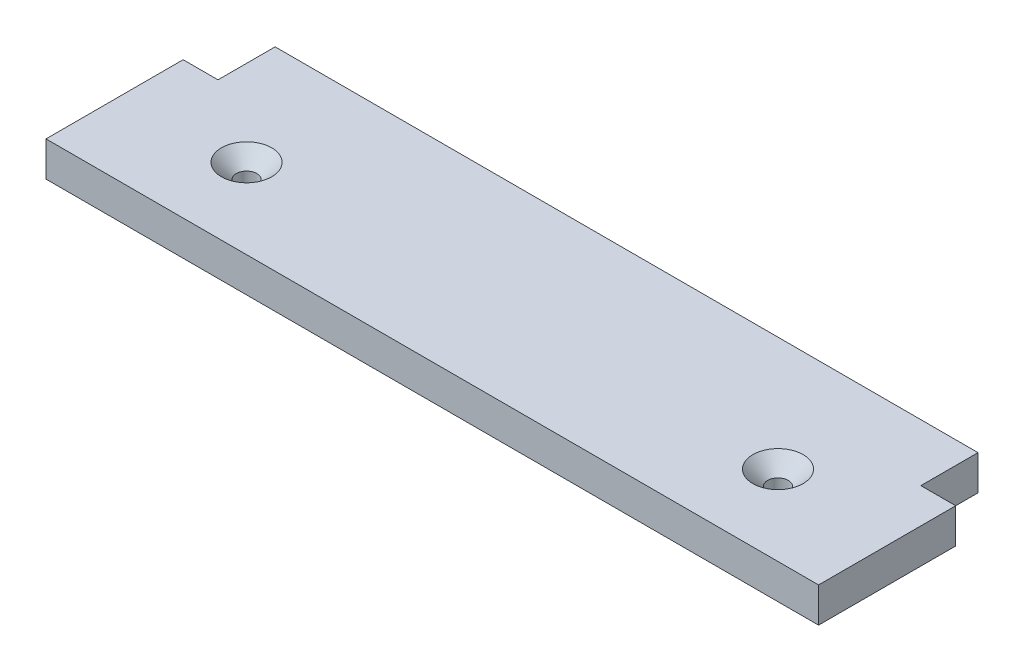
ISO-10303-21;
HEADER;
FILE_DESCRIPTION(('STEP AP214'),'2;1');
FILE_NAME('part.step','',(''),(''),'','','');
FILE_SCHEMA(('AUTOMOTIVE_DESIGN { 1 0 10303 214 1 1 1 1 }'));
ENDSEC;
DATA;
#1=APPLICATION_CONTEXT('core data for automotive mechanical design processes');
#2=APPLICATION_PROTOCOL_DEFINITION('international standard','automotive_design',2000,#1);
#3=PRODUCT_CONTEXT('',#1,'mechanical');
#4=PRODUCT('Part','Part','',(#3));
#5=PRODUCT_RELATED_PRODUCT_CATEGORY('part','',(#4));
#6=PRODUCT_DEFINITION_FORMATION('','',#4);
#7=PRODUCT_DEFINITION_CONTEXT('part definition',#1,'design');
#8=PRODUCT_DEFINITION('design','',#6,#7);
#9=PRODUCT_DEFINITION_SHAPE('','',#8);
#10=(LENGTH_UNIT() NAMED_UNIT(*) SI_UNIT(.MILLI.,.METRE.));
#11=(NAMED_UNIT(*) PLANE_ANGLE_UNIT() SI_UNIT($,.RADIAN.));
#12=(NAMED_UNIT(*) SI_UNIT($,.STERADIAN.) SOLID_ANGLE_UNIT());
#13=UNCERTAINTY_MEASURE_WITH_UNIT(LENGTH_MEASURE(1.E-05),#10,'distance_accuracy_value','');
#14=(GEOMETRIC_REPRESENTATION_CONTEXT(3) GLOBAL_UNCERTAINTY_ASSIGNED_CONTEXT((#13)) GLOBAL_UNIT_ASSIGNED_CONTEXT((#10,
#11,#12)) REPRESENTATION_CONTEXT('',''));
#15=CARTESIAN_POINT('',(0.,0.,0.));
#16=DIRECTION('',(0.,0.,1.));
#17=DIRECTION('',(1.,0.,0.));
#18=AXIS2_PLACEMENT_3D('',#15,#16,#17);
#19=CARTESIAN_POINT('',(67.6,3.05,0.));
#20=DIRECTION('',(-1.,0.,0.));
#21=DIRECTION('',(0.,0.,1.));
#22=AXIS2_PLACEMENT_3D('',#19,#20,#21);
#23=PLANE('',#22);
#24=DIRECTION('',(0.,0.,-1.));
#25=VECTOR('',#24,1.);
#26=CARTESIAN_POINT('',(67.6,0.,0.));
#27=LINE('',#26,#25);
#28=CARTESIAN_POINT('',(67.6,0.,0.));
#29=VERTEX_POINT('',#28);
#30=CARTESIAN_POINT('',(67.6,0.,-12.));
#31=VERTEX_POINT('',#30);
#32=EDGE_CURVE('E155',#29,#31,#27,.T.);
#33=ORIENTED_EDGE('',*,*,#32,.T.);
#34=DIRECTION('',(0.,-1.,0.));
#35=VECTOR('',#34,1.);
#36=CARTESIAN_POINT('',(67.6,3.05,-12.));
#37=LINE('',#36,#35);
#38=CARTESIAN_POINT('',(67.6,3.05,-12.));
#39=VERTEX_POINT('',#38);
#40=EDGE_CURVE('E11',#39,#31,#37,.T.);
#41=ORIENTED_EDGE('',*,*,#40,.F.);
#42=DIRECTION('',(0.,0.,-1.));
#43=VECTOR('',#42,1.);
#44=CARTESIAN_POINT('',(67.6,3.05,0.));
#45=LINE('',#44,#43);
#46=CARTESIAN_POINT('',(67.6,3.05,0.));
#47=VERTEX_POINT('',#46);
#48=EDGE_CURVE('E182',#47,#39,#45,.T.);
#49=ORIENTED_EDGE('',*,*,#48,.F.);
#50=DIRECTION('',(0.,-1.,0.));
#51=VECTOR('',#50,1.);
#52=CARTESIAN_POINT('',(67.6,3.05,0.));
#53=LINE('',#52,#51);
#54=EDGE_CURVE('E142',#47,#29,#53,.T.);
#55=ORIENTED_EDGE('',*,*,#54,.T.);
#56=EDGE_LOOP('',(#33,#41,#49,#55));
#57=FACE_BOUND('',#56,.T.);
#58=ADVANCED_FACE('F45',(#57),#23,.F.);
#59=CARTESIAN_POINT('',(0.,3.05,-12.));
#60=DIRECTION('',(0.,0.,1.));
#61=DIRECTION('',(1.,0.,0.));
#62=AXIS2_PLACEMENT_3D('',#59,#60,#61);
#63=PLANE('',#62);
#64=DIRECTION('',(-1.,0.,0.));
#65=VECTOR('',#64,1.);
#66=CARTESIAN_POINT('',(0.,0.,-12.));
#67=LINE('',#66,#65);
#68=CARTESIAN_POINT('',(64.55,0.,-12.));
#69=VERTEX_POINT('',#68);
#70=EDGE_CURVE('E159',#31,#69,#67,.T.);
#71=ORIENTED_EDGE('',*,*,#70,.T.);
#72=DIRECTION('',(0.,-1.,0.));
#73=VECTOR('',#72,1.);
#74=CARTESIAN_POINT('',(64.55,3.05,-12.));
#75=LINE('',#74,#73);
#76=CARTESIAN_POINT('',(64.55,3.05,-12.));
#77=VERTEX_POINT('',#76);
#78=EDGE_CURVE('E55',#77,#69,#75,.T.);
#79=ORIENTED_EDGE('',*,*,#78,.F.);
#80=DIRECTION('',(-1.,0.,0.));
#81=VECTOR('',#80,1.);
#82=CARTESIAN_POINT('',(0.,3.05,-12.));
#83=LINE('',#82,#81);
#84=EDGE_CURVE('E102',#39,#77,#83,.T.);
#85=ORIENTED_EDGE('',*,*,#84,.F.);
#86=ORIENTED_EDGE('',*,*,#40,.T.);
#87=EDGE_LOOP('',(#71,#79,#85,#86));
#88=FACE_BOUND('',#87,.T.);
#89=ADVANCED_FACE('F201',(#88),#63,.F.);
#90=CARTESIAN_POINT('',(64.55,3.05,0.));
#91=DIRECTION('',(1.,0.,0.));
#92=DIRECTION('',(0.,0.,-1.));
#93=AXIS2_PLACEMENT_3D('',#90,#91,#92);
#94=PLANE('',#93);
#95=DIRECTION('',(0.,0.,1.));
#96=VECTOR('',#95,1.);
#97=CARTESIAN_POINT('',(64.55,0.,0.));
#98=LINE('',#97,#96);
#99=CARTESIAN_POINT('',(64.55,0.,-17.));
#100=VERTEX_POINT('',#99);
#101=EDGE_CURVE('E163',#100,#69,#98,.T.);
#102=ORIENTED_EDGE('',*,*,#101,.F.);
#103=DIRECTION('',(0.,-1.,0.));
#104=VECTOR('',#103,1.);
#105=CARTESIAN_POINT('',(64.55,3.05,-17.));
#106=LINE('',#105,#104);
#107=CARTESIAN_POINT('',(64.55,3.05,-17.));
#108=VERTEX_POINT('',#107);
#109=EDGE_CURVE('E192',#108,#100,#106,.T.);
#110=ORIENTED_EDGE('',*,*,#109,.F.);
#111=DIRECTION('',(0.,0.,1.));
#112=VECTOR('',#111,1.);
#113=CARTESIAN_POINT('',(64.55,3.05,0.));
#114=LINE('',#113,#112);
#115=EDGE_CURVE('E200',#108,#77,#114,.T.);
#116=ORIENTED_EDGE('',*,*,#115,.T.);
#117=ORIENTED_EDGE('',*,*,#78,.T.);
#118=EDGE_LOOP('',(#102,#110,#116,#117));
#119=FACE_BOUND('',#118,.T.);
#120=ADVANCED_FACE('F198',(#119),#94,.T.);
#121=CARTESIAN_POINT('',(0.,3.05,-17.));
#122=DIRECTION('',(0.,0.,-1.));
#123=DIRECTION('',(-1.,0.,0.));
#124=AXIS2_PLACEMENT_3D('',#121,#122,#123);
#125=PLANE('',#124);
#126=DIRECTION('',(1.,0.,0.));
#127=VECTOR('',#126,1.);
#128=CARTESIAN_POINT('',(0.,0.,-17.));
#129=LINE('',#128,#127);
#130=CARTESIAN_POINT('',(3.05,0.,-17.));
#131=VERTEX_POINT('',#130);
#132=EDGE_CURVE('E167',#131,#100,#129,.T.);
#133=ORIENTED_EDGE('',*,*,#132,.F.);
#134=DIRECTION('',(0.,-1.,0.));
#135=VECTOR('',#134,1.);
#136=CARTESIAN_POINT('',(3.05,3.05,-17.));
#137=LINE('',#136,#135);
#138=CARTESIAN_POINT('',(3.05,3.05,-17.));
#139=VERTEX_POINT('',#138);
#140=EDGE_CURVE('E189',#139,#131,#137,.T.);
#141=ORIENTED_EDGE('',*,*,#140,.F.);
#142=DIRECTION('',(1.,0.,0.));
#143=VECTOR('',#142,1.);
#144=CARTESIAN_POINT('',(0.,3.05,-17.));
#145=LINE('',#144,#143);
#146=EDGE_CURVE('E211',#139,#108,#145,.T.);
#147=ORIENTED_EDGE('',*,*,#146,.T.);
#148=ORIENTED_EDGE('',*,*,#109,.T.);
#149=EDGE_LOOP('',(#133,#141,#147,#148));
#150=FACE_BOUND('',#149,.T.);
#151=ADVANCED_FACE('F209',(#150),#125,.T.);
#152=CARTESIAN_POINT('',(3.05,3.05,0.));
#153=DIRECTION('',(1.,0.,0.));
#154=DIRECTION('',(0.,0.,-1.));
#155=AXIS2_PLACEMENT_3D('',#152,#153,#154);
#156=PLANE('',#155);
#157=DIRECTION('',(0.,0.,1.));
#158=VECTOR('',#157,1.);
#159=CARTESIAN_POINT('',(3.05,0.,0.));
#160=LINE('',#159,#158);
#161=CARTESIAN_POINT('',(3.05,0.,-12.));
#162=VERTEX_POINT('',#161);
#163=EDGE_CURVE('E171',#131,#162,#160,.T.);
#164=ORIENTED_EDGE('',*,*,#163,.T.);
#165=DIRECTION('',(0.,-1.,0.));
#166=VECTOR('',#165,1.);
#167=CARTESIAN_POINT('',(3.05,3.05,-12.));
#168=LINE('',#167,#166);
#169=CARTESIAN_POINT('',(3.05,3.05,-12.));
#170=VERTEX_POINT('',#169);
#171=EDGE_CURVE('E128',#170,#162,#168,.T.);
#172=ORIENTED_EDGE('',*,*,#171,.F.);
#173=DIRECTION('',(0.,0.,1.));
#174=VECTOR('',#173,1.);
#175=CARTESIAN_POINT('',(3.05,3.05,0.));
#176=LINE('',#175,#174);
#177=EDGE_CURVE('E134',#139,#170,#176,.T.);
#178=ORIENTED_EDGE('',*,*,#177,.F.);
#179=ORIENTED_EDGE('',*,*,#140,.T.);
#180=EDGE_LOOP('',(#164,#172,#178,#179));
#181=FACE_BOUND('',#180,.T.);
#182=ADVANCED_FACE('F282',(#181),#156,.F.);
#183=CARTESIAN_POINT('',(0.,3.05,-12.));
#184=DIRECTION('',(0.,0.,-1.));
#185=DIRECTION('',(-1.,0.,0.));
#186=AXIS2_PLACEMENT_3D('',#183,#184,#185);
#187=PLANE('',#186);
#188=DIRECTION('',(1.,0.,0.));
#189=VECTOR('',#188,1.);
#190=CARTESIAN_POINT('',(0.,0.,-12.));
#191=LINE('',#190,#189);
#192=CARTESIAN_POINT('',(0.,0.,-12.));
#193=VERTEX_POINT('',#192);
#194=EDGE_CURVE('E122',#193,#162,#191,.T.);
#195=ORIENTED_EDGE('',*,*,#194,.F.);
#196=DIRECTION('',(0.,-1.,0.));
#197=VECTOR('',#196,1.);
#198=CARTESIAN_POINT('',(0.,3.05,-12.));
#199=LINE('',#198,#197);
#200=CARTESIAN_POINT('',(0.,3.05,-12.));
#201=VERTEX_POINT('',#200);
#202=EDGE_CURVE('E117',#201,#193,#199,.T.);
#203=ORIENTED_EDGE('',*,*,#202,.F.);
#204=DIRECTION('',(1.,0.,0.));
#205=VECTOR('',#204,1.);
#206=CARTESIAN_POINT('',(0.,3.05,-12.));
#207=LINE('',#206,#205);
#208=EDGE_CURVE('E120',#201,#170,#207,.T.);
#209=ORIENTED_EDGE('',*,*,#208,.T.);
#210=ORIENTED_EDGE('',*,*,#171,.T.);
#211=EDGE_LOOP('',(#195,#203,#209,#210));
#212=FACE_BOUND('',#211,.T.);
#213=ADVANCED_FACE('F119',(#212),#187,.T.);
#214=CARTESIAN_POINT('',(0.,3.05,0.));
#215=DIRECTION('',(-1.,0.,0.));
#216=DIRECTION('',(0.,0.,1.));
#217=AXIS2_PLACEMENT_3D('',#214,#215,#216);
#218=PLANE('',#217);
#219=DIRECTION('',(0.,0.,-1.));
#220=VECTOR('',#219,1.);
#221=CARTESIAN_POINT('',(0.,0.,0.));
#222=LINE('',#221,#220);
#223=CARTESIAN_POINT('',(0.,0.,0.));
#224=VERTEX_POINT('',#223);
#225=EDGE_CURVE('E177',#224,#193,#222,.T.);
#226=ORIENTED_EDGE('',*,*,#225,.F.);
#227=DIRECTION('',(0.,-1.,0.));
#228=VECTOR('',#227,1.);
#229=CARTESIAN_POINT('',(0.,3.05,0.));
#230=LINE('',#229,#228);
#231=CARTESIAN_POINT('',(0.,3.05,0.));
#232=VERTEX_POINT('',#231);
#233=EDGE_CURVE('E91',#232,#224,#230,.T.);
#234=ORIENTED_EDGE('',*,*,#233,.F.);
#235=DIRECTION('',(0.,0.,-1.));
#236=VECTOR('',#235,1.);
#237=CARTESIAN_POINT('',(0.,3.05,0.));
#238=LINE('',#237,#236);
#239=EDGE_CURVE('E131',#232,#201,#238,.T.);
#240=ORIENTED_EDGE('',*,*,#239,.T.);
#241=ORIENTED_EDGE('',*,*,#202,.T.);
#242=EDGE_LOOP('',(#226,#234,#240,#241));
#243=FACE_BOUND('',#242,.T.);
#244=ADVANCED_FACE('F138',(#243),#218,.T.);
#245=CARTESIAN_POINT('',(10.55,3.05,-7.));
#246=DIRECTION('',(0.,-1.,0.));
#247=DIRECTION('',(0.,0.,-1.));
#248=AXIS2_PLACEMENT_3D('',#245,#246,#247);
#249=CYLINDRICAL_SURFACE('',#248,0.9);
#250=CARTESIAN_POINT('',(10.55,1.75,-7.));
#251=DIRECTION('',(0.,1.,0.));
#252=DIRECTION('',(0.,0.,1.));
#253=AXIS2_PLACEMENT_3D('',#250,#251,#252);
#254=CIRCLE('',#253,0.9);
#255=CARTESIAN_POINT('',(10.55,1.75,-6.1));
#256=VERTEX_POINT('',#255);
#257=EDGE_CURVE('E151',#256,#256,#254,.T.);
#258=ORIENTED_EDGE('',*,*,#257,.T.);
#259=EDGE_LOOP('',(#258));
#260=FACE_BOUND('',#259,.T.);
#261=CARTESIAN_POINT('',(10.55,0.,-7.));
#262=DIRECTION('',(0.,1.,0.));
#263=DIRECTION('',(0.,0.,1.));
#264=AXIS2_PLACEMENT_3D('',#261,#262,#263);
#265=CIRCLE('',#264,0.9);
#266=CARTESIAN_POINT('',(10.55,0.,-6.1));
#267=VERTEX_POINT('',#266);
#268=EDGE_CURVE('E150',#267,#267,#265,.T.);
#269=ORIENTED_EDGE('',*,*,#268,.F.);
#270=EDGE_LOOP('',(#269));
#271=FACE_BOUND('',#270,.T.);
#272=ADVANCED_FACE('F267',(#260,#271),#249,.F.);
#273=CARTESIAN_POINT('',(57.05,3.05,-7.));
#274=DIRECTION('',(0.,-1.,0.));
#275=DIRECTION('',(0.,0.,-1.));
#276=AXIS2_PLACEMENT_3D('',#273,#274,#275);
#277=CYLINDRICAL_SURFACE('',#276,0.899999999999997);
#278=CARTESIAN_POINT('',(57.05,1.74999999999999,-7.));
#279=DIRECTION('',(0.,1.,0.));
#280=DIRECTION('',(0.,0.,1.));
#281=AXIS2_PLACEMENT_3D('',#278,#279,#280);
#282=CIRCLE('',#281,0.899999999999984);
#283=CARTESIAN_POINT('',(57.05,1.74999999999999,-6.10000000000001));
#284=VERTEX_POINT('',#283);
#285=EDGE_CURVE('E229',#284,#284,#282,.T.);
#286=ORIENTED_EDGE('',*,*,#285,.T.);
#287=EDGE_LOOP('',(#286));
#288=FACE_BOUND('',#287,.T.);
#289=CARTESIAN_POINT('',(57.05,0.,-7.));
#290=DIRECTION('',(0.,1.,0.));
#291=DIRECTION('',(0.,0.,1.));
#292=AXIS2_PLACEMENT_3D('',#289,#290,#291);
#293=CIRCLE('',#292,0.899999999999997);
#294=CARTESIAN_POINT('',(57.05,0.,-6.1));
#295=VERTEX_POINT('',#294);
#296=EDGE_CURVE('E146',#295,#295,#293,.T.);
#297=ORIENTED_EDGE('',*,*,#296,.F.);
#298=EDGE_LOOP('',(#297));
#299=FACE_BOUND('',#298,.T.);
#300=ADVANCED_FACE('F47',(#288,#299),#277,.F.);
#301=CARTESIAN_POINT('',(0.,3.05,0.));
#302=DIRECTION('',(0.,0.,-1.));
#303=DIRECTION('',(-1.,0.,0.));
#304=AXIS2_PLACEMENT_3D('',#301,#302,#303);
#305=PLANE('',#304);
#306=DIRECTION('',(1.,0.,0.));
#307=VECTOR('',#306,1.);
#308=CARTESIAN_POINT('',(0.,0.,0.));
#309=LINE('',#308,#307);
#310=EDGE_CURVE('E94',#224,#29,#309,.T.);
#311=ORIENTED_EDGE('',*,*,#310,.T.);
#312=ORIENTED_EDGE('',*,*,#54,.F.);
#313=DIRECTION('',(1.,0.,0.));
#314=VECTOR('',#313,1.);
#315=CARTESIAN_POINT('',(0.,3.05,0.));
#316=LINE('',#315,#314);
#317=EDGE_CURVE('E63',#232,#47,#316,.T.);
#318=ORIENTED_EDGE('',*,*,#317,.F.);
#319=ORIENTED_EDGE('',*,*,#233,.T.);
#320=EDGE_LOOP('',(#311,#312,#318,#319));
#321=FACE_BOUND('',#320,.T.);
#322=ADVANCED_FACE('F242',(#321),#305,.F.);
#323=CARTESIAN_POINT('',(0.,3.05,0.));
#324=DIRECTION('',(0.,1.,0.));
#325=DIRECTION('',(0.,0.,1.));
#326=AXIS2_PLACEMENT_3D('',#323,#324,#325);
#327=PLANE('',#326);
#328=CARTESIAN_POINT('',(57.05,3.05,-7.));
#329=DIRECTION('',(0.,1.,0.));
#330=DIRECTION('',(0.,0.,1.));
#331=AXIS2_PLACEMENT_3D('',#328,#329,#330);
#332=CIRCLE('',#331,2.2);
#333=CARTESIAN_POINT('',(57.05,3.05,-4.8));
#334=VERTEX_POINT('',#333);
#335=EDGE_CURVE('E233',#334,#334,#332,.T.);
#336=ORIENTED_EDGE('',*,*,#335,.F.);
#337=EDGE_LOOP('',(#336));
#338=FACE_BOUND('',#337,.T.);
#339=CARTESIAN_POINT('',(10.55,3.05,-7.));
#340=DIRECTION('',(0.,1.,0.));
#341=DIRECTION('',(0.,0.,1.));
#342=AXIS2_PLACEMENT_3D('',#339,#340,#341);
#343=CIRCLE('',#342,2.2);
#344=CARTESIAN_POINT('',(10.55,3.05,-4.8));
#345=VERTEX_POINT('',#344);
#346=EDGE_CURVE('E225',#345,#345,#343,.T.);
#347=ORIENTED_EDGE('',*,*,#346,.F.);
#348=EDGE_LOOP('',(#347));
#349=FACE_BOUND('',#348,.T.);
#350=ORIENTED_EDGE('',*,*,#48,.T.);
#351=ORIENTED_EDGE('',*,*,#84,.T.);
#352=ORIENTED_EDGE('',*,*,#115,.F.);
#353=ORIENTED_EDGE('',*,*,#146,.F.);
#354=ORIENTED_EDGE('',*,*,#177,.T.);
#355=ORIENTED_EDGE('',*,*,#208,.F.);
#356=ORIENTED_EDGE('',*,*,#239,.F.);
#357=ORIENTED_EDGE('',*,*,#317,.T.);
#358=EDGE_LOOP('',(#350,#351,#352,#353,#354,#355,#356,#357));
#359=FACE_BOUND('',#358,.T.);
#360=ADVANCED_FACE('F130',(#338,#349,#359),#327,.T.);
#361=CARTESIAN_POINT('',(0.,0.,0.));
#362=DIRECTION('',(0.,1.,0.));
#363=DIRECTION('',(0.,0.,1.));
#364=AXIS2_PLACEMENT_3D('',#361,#362,#363);
#365=PLANE('',#364);
#366=ORIENTED_EDGE('',*,*,#296,.T.);
#367=EDGE_LOOP('',(#366));
#368=FACE_BOUND('',#367,.T.);
#369=ORIENTED_EDGE('',*,*,#268,.T.);
#370=EDGE_LOOP('',(#369));
#371=FACE_BOUND('',#370,.T.);
#372=ORIENTED_EDGE('',*,*,#32,.F.);
#373=ORIENTED_EDGE('',*,*,#310,.F.);
#374=ORIENTED_EDGE('',*,*,#225,.T.);
#375=ORIENTED_EDGE('',*,*,#194,.T.);
#376=ORIENTED_EDGE('',*,*,#163,.F.);
#377=ORIENTED_EDGE('',*,*,#132,.T.);
#378=ORIENTED_EDGE('',*,*,#101,.T.);
#379=ORIENTED_EDGE('',*,*,#70,.F.);
#380=EDGE_LOOP('',(#372,#373,#374,#375,#376,#377,#378,#379));
#381=FACE_BOUND('',#380,.T.);
#382=ADVANCED_FACE('F205',(#368,#371,#381),#365,.F.);
#383=CARTESIAN_POINT('',(10.55,3.05,-7.));
#384=DIRECTION('',(0.,1.,0.));
#385=DIRECTION('',(0.,0.,1.));
#386=AXIS2_PLACEMENT_3D('',#383,#384,#385);
#387=CONICAL_SURFACE('',#386,2.2,0.785398163397448);
#388=ORIENTED_EDGE('',*,*,#257,.F.);
#389=EDGE_LOOP('',(#388));
#390=FACE_BOUND('',#389,.T.);
#391=ORIENTED_EDGE('',*,*,#346,.T.);
#392=EDGE_LOOP('',(#391));
#393=FACE_BOUND('',#392,.T.);
#394=ADVANCED_FACE('F246',(#390,#393),#387,.F.);
#395=CARTESIAN_POINT('',(57.05,3.05,-7.));
#396=DIRECTION('',(0.,1.,0.));
#397=DIRECTION('',(0.,0.,1.));
#398=AXIS2_PLACEMENT_3D('',#395,#396,#397);
#399=CONICAL_SURFACE('',#398,2.2,0.78539816339745);
#400=ORIENTED_EDGE('',*,*,#285,.F.);
#401=EDGE_LOOP('',(#400));
#402=FACE_BOUND('',#401,.T.);
#403=ORIENTED_EDGE('',*,*,#335,.T.);
#404=EDGE_LOOP('',(#403));
#405=FACE_BOUND('',#404,.T.);
#406=ADVANCED_FACE('F238',(#402,#405),#399,.F.);
#407=CLOSED_SHELL('',(#58,#89,#120,#151,#182,#213,#244,#272,#300,#322,#360,#382,#394,#406));
#408=MANIFOLD_SOLID_BREP('B2',#407);
#409=ADVANCED_BREP_SHAPE_REPRESENTATION('',(#18,#408),#14);
#410=SHAPE_DEFINITION_REPRESENTATION(#9,#409);
ENDSEC;
END-ISO-10303-21;
